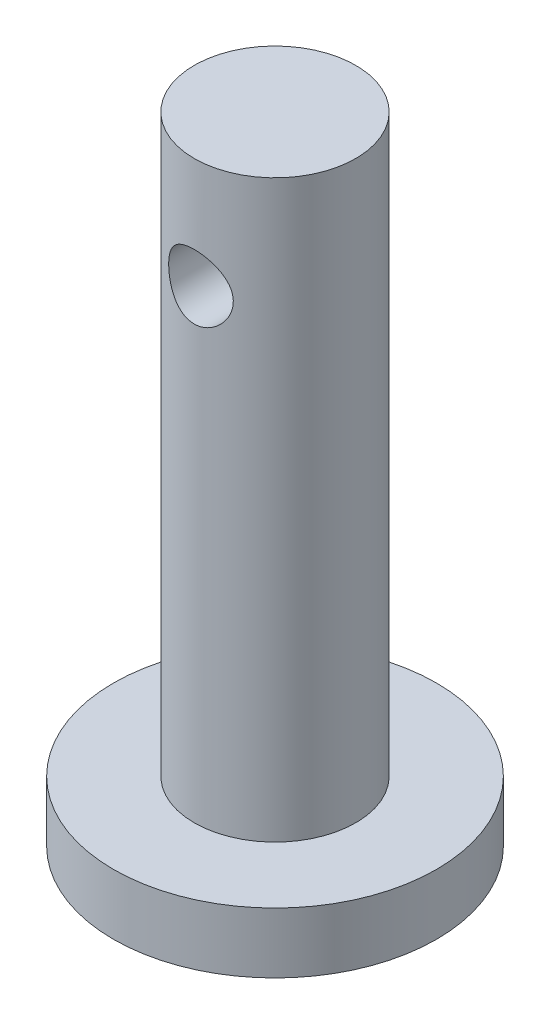
ISO-10303-21;
HEADER;
FILE_DESCRIPTION(('STEP AP214'),'2;1');
FILE_NAME('part.step','',(''),(''),'','','');
FILE_SCHEMA(('AUTOMOTIVE_DESIGN { 1 0 10303 214 1 1 1 1 }'));
ENDSEC;
DATA;
#1=APPLICATION_CONTEXT('core data for automotive mechanical design processes');
#2=APPLICATION_PROTOCOL_DEFINITION('international standard','automotive_design',2000,#1);
#3=PRODUCT_CONTEXT('',#1,'mechanical');
#4=PRODUCT('Part','Part','',(#3));
#5=PRODUCT_RELATED_PRODUCT_CATEGORY('part','',(#4));
#6=PRODUCT_DEFINITION_FORMATION('','',#4);
#7=PRODUCT_DEFINITION_CONTEXT('part definition',#1,'design');
#8=PRODUCT_DEFINITION('design','',#6,#7);
#9=PRODUCT_DEFINITION_SHAPE('','',#8);
#10=(LENGTH_UNIT() NAMED_UNIT(*) SI_UNIT(.MILLI.,.METRE.));
#11=(NAMED_UNIT(*) PLANE_ANGLE_UNIT() SI_UNIT($,.RADIAN.));
#12=(NAMED_UNIT(*) SI_UNIT($,.STERADIAN.) SOLID_ANGLE_UNIT());
#13=UNCERTAINTY_MEASURE_WITH_UNIT(LENGTH_MEASURE(1.E-05),#10,'distance_accuracy_value','');
#14=(GEOMETRIC_REPRESENTATION_CONTEXT(3) GLOBAL_UNCERTAINTY_ASSIGNED_CONTEXT((#13)) GLOBAL_UNIT_ASSIGNED_CONTEXT((#10,
#11,#12)) REPRESENTATION_CONTEXT('',''));
#15=CARTESIAN_POINT('',(0.,0.,0.));
#16=DIRECTION('',(0.,0.,1.));
#17=DIRECTION('',(1.,0.,0.));
#18=AXIS2_PLACEMENT_3D('',#15,#16,#17);
#19=CARTESIAN_POINT('',(0.,31.5,0.));
#20=DIRECTION('',(0.,-1.,0.));
#21=DIRECTION('',(0.,0.,-1.));
#22=AXIS2_PLACEMENT_3D('',#19,#20,#21);
#23=CYLINDRICAL_SURFACE('',#22,4.);
#24=CARTESIAN_POINT('',(0.,3.,0.));
#25=DIRECTION('',(0.,1.,0.));
#26=DIRECTION('',(0.,0.,1.));
#27=AXIS2_PLACEMENT_3D('',#24,#25,#26);
#28=CIRCLE('',#27,4.);
#29=CARTESIAN_POINT('',(0.,3.,4.));
#30=VERTEX_POINT('',#29);
#31=EDGE_CURVE('E53',#30,#30,#28,.T.);
#32=ORIENTED_EDGE('',*,*,#31,.T.);
#33=EDGE_LOOP('',(#32));
#34=FACE_BOUND('',#33,.T.);
#35=CARTESIAN_POINT('',(0.,31.5,0.));
#36=DIRECTION('',(0.,1.,0.));
#37=DIRECTION('',(0.,0.,1.));
#38=AXIS2_PLACEMENT_3D('',#35,#36,#37);
#39=CIRCLE('',#38,4.);
#40=CARTESIAN_POINT('',(0.,31.5,4.));
#41=VERTEX_POINT('',#40);
#42=EDGE_CURVE('E90',#41,#41,#39,.T.);
#43=ORIENTED_EDGE('',*,*,#42,.F.);
#44=EDGE_LOOP('',(#43));
#45=FACE_BOUND('',#44,.T.);
#46=CARTESIAN_POINT('',(-1.6,26.,3.66606055596467));
#47=CARTESIAN_POINT('',(-1.59999060336303,25.9142884015201,3.66606921325137));
#48=CARTESIAN_POINT('',(-1.59307185487548,25.8284555722362,3.66910881987412));
#49=CARTESIAN_POINT('',(-1.56565522447419,25.6592521336983,3.68088731350276));
#50=CARTESIAN_POINT('',(-1.5451226435537,25.5758883863356,3.68964076309481));
#51=CARTESIAN_POINT('',(-1.49138802605496,25.414357646424,3.71168364633037));
#52=CARTESIAN_POINT('',(-1.45823372202034,25.3361723621118,3.72495597085692));
#53=CARTESIAN_POINT('',(-1.38033621549729,25.1864919593123,3.75451732076224));
#54=CARTESIAN_POINT('',(-1.335595543414,25.1149953846793,3.77080568723138));
#55=CARTESIAN_POINT('',(-1.23305757966993,24.9765916782068,3.80560692040826));
#56=CARTESIAN_POINT('',(-1.17470348618186,24.9101148616564,3.82419134366997));
#57=CARTESIAN_POINT('',(-1.04776728461923,24.7875768021477,3.86089965583049));
#58=CARTESIAN_POINT('',(-0.979181617340544,24.7315191989681,3.87902338189098));
#59=CARTESIAN_POINT('',(-0.830405048285102,24.6292748824138,3.91362726325484));
#60=CARTESIAN_POINT('',(-0.749863172489824,24.5835645588235,3.93001442946855));
#61=CARTESIAN_POINT('',(-0.581460258300094,24.5065251452882,3.95843142105237));
#62=CARTESIAN_POINT('',(-0.493602215430367,24.4751902033744,3.97046301907739));
#63=CARTESIAN_POINT('',(-0.317573141471112,24.4293268108501,3.98830660006628));
#64=CARTESIAN_POINT('',(-0.229623187843683,24.4140581487288,3.99439149420286));
#65=CARTESIAN_POINT('',(-0.0522130629101198,24.3983772114698,4.00064248546163));
#66=CARTESIAN_POINT('',(0.0372465326603232,24.3979593952521,4.0008107901545));
#67=CARTESIAN_POINT('',(0.20978599577225,24.41158621582,3.99537570257429));
#68=CARTESIAN_POINT('',(0.292941962299227,24.4248198181975,3.99009597417469));
#69=CARTESIAN_POINT('',(0.455738487374671,24.4639943010486,3.97479433175032));
#70=CARTESIAN_POINT('',(0.535378787512127,24.4899361139203,3.9647720697689));
#71=CARTESIAN_POINT('',(0.690318350809326,24.554109186301,3.9407745956616));
#72=CARTESIAN_POINT('',(0.765534098703708,24.5925197718524,3.9267420837344));
#73=CARTESIAN_POINT('',(0.908646520592461,24.6803720055352,3.89611668143758));
#74=CARTESIAN_POINT('',(0.976540674172888,24.7298174344781,3.87952291412059));
#75=CARTESIAN_POINT('',(1.10781506239372,24.8421193087573,3.84417309742667));
#76=CARTESIAN_POINT('',(1.17060627621891,24.9056431140671,3.82534661216192));
#77=CARTESIAN_POINT('',(1.28488593230826,25.0423924574568,3.78849328771823));
#78=CARTESIAN_POINT('',(1.33637067500773,25.1156211585233,3.77046671181078));
#79=CARTESIAN_POINT('',(1.42792335099435,25.2723352179272,3.7367751795345));
#80=CARTESIAN_POINT('',(1.46762772138792,25.3560518643871,3.72119131345105));
#81=CARTESIAN_POINT('',(1.53214100797301,25.5297723923696,3.69510072373859));
#82=CARTESIAN_POINT('',(1.55695959872352,25.6197721478167,3.68459070338672));
#83=CARTESIAN_POINT('',(1.58956395906557,25.7976286219488,3.67063807738052));
#84=CARTESIAN_POINT('',(1.59829767744673,25.8852803576961,3.6668029315846));
#85=CARTESIAN_POINT('',(1.60124906115921,26.0608617662144,3.66551598301679));
#86=CARTESIAN_POINT('',(1.59547112847431,26.1487913466223,3.6680622444997));
#87=CARTESIAN_POINT('',(1.57042631583082,26.3171671479639,3.67884835485706));
#88=CARTESIAN_POINT('',(1.55194644961876,26.3977543499196,3.68675566238216));
#89=CARTESIAN_POINT('',(1.50304334952902,26.5546307238288,3.70696040822297));
#90=CARTESIAN_POINT('',(1.47261746744191,26.6309189384859,3.71925881990995));
#91=CARTESIAN_POINT('',(1.39930851158516,26.7804818862364,3.7474702548796));
#92=CARTESIAN_POINT('',(1.35597029461168,26.8535089509556,3.76350963711308));
#93=CARTESIAN_POINT('',(1.2585321795535,26.9915863899533,3.7972030812627));
#94=CARTESIAN_POINT('',(1.20442789878559,27.0566334982365,3.8148577991685));
#95=CARTESIAN_POINT('',(1.08227536934439,27.1818987268794,3.85136732777118));
#96=CARTESIAN_POINT('',(1.01349234355608,27.2414052522328,3.87021445828162));
#97=CARTESIAN_POINT('',(0.866466906695075,27.3481416612883,3.9057583565405));
#98=CARTESIAN_POINT('',(0.78822411077429,27.3953710452778,3.92245503674592));
#99=CARTESIAN_POINT('',(0.624223947201408,27.476038101169,3.95186972720228));
#100=CARTESIAN_POINT('',(0.538468384795252,27.5094790753326,3.96458868992219));
#101=CARTESIAN_POINT('',(0.36191487273538,27.5612390819261,3.98458170775432));
#102=CARTESIAN_POINT('',(0.271119688235416,27.5795663211521,3.99185871766035));
#103=CARTESIAN_POINT('',(0.0934532082770425,27.5996037613003,3.9998320656841));
#104=CARTESIAN_POINT('',(0.00671239407444431,27.6023201027701,4.00092677395898));
#105=CARTESIAN_POINT('',(-0.165947068586595,27.5937156165727,3.99748833902874));
#106=CARTESIAN_POINT('',(-0.251865839515698,27.5823969137715,3.9929560477353));
#107=CARTESIAN_POINT('',(-0.417736721557129,27.5467625693132,3.97897210691404));
#108=CARTESIAN_POINT('',(-0.497791043718707,27.5228568431396,3.96967584507464));
#109=CARTESIAN_POINT('',(-0.652737883807151,27.4631577563505,3.9471595826563));
#110=CARTESIAN_POINT('',(-0.727629446613821,27.4273622031837,3.93393885843209));
#111=CARTESIAN_POINT('',(-0.873762433484893,27.3431174412085,3.90414475488046));
#112=CARTESIAN_POINT('',(-0.944696309445141,27.2941789640919,3.88744903782584));
#113=CARTESIAN_POINT('',(-1.07764322281926,27.1857691846569,3.85271522549158));
#114=CARTESIAN_POINT('',(-1.13965254859661,27.1262935228319,3.834676576404));
#115=CARTESIAN_POINT('',(-1.25696101206879,26.99414782038,3.79790210847538));
#116=CARTESIAN_POINT('',(-1.31160710975922,26.9208889012791,3.77919226084307));
#117=CARTESIAN_POINT('',(-1.40787796035152,26.765646290057,3.74439737180144));
#118=CARTESIAN_POINT('',(-1.44950118231999,26.6836615736721,3.72831263909964));
#119=CARTESIAN_POINT('',(-1.51519287013865,26.5207702385215,3.70207091566326));
#120=CARTESIAN_POINT('',(-1.54050201133137,26.4404278121991,3.69151134889319));
#121=CARTESIAN_POINT('',(-1.57817420625471,26.2764116642957,3.67556802883171));
#122=CARTESIAN_POINT('',(-1.59057333431041,26.1927479072264,3.6701698565774));
#123=CARTESIAN_POINT('',(-1.59877140664814,26.0724979501297,3.66659567006108));
#124=CARTESIAN_POINT('',(-1.6000039751959,26.0362598232019,3.66605689354686));
#125=CARTESIAN_POINT('',(-1.6,26.,3.66606055596467));
#126=B_SPLINE_CURVE_WITH_KNOTS('',3,(#46,#47,#48,#49,#50,#51,#52,#53,#54,#55,#56,#57,#58,#59,
#60,#61,#62,#63,#64,#65,#66,#67,#68,#69,#70,#71,#72,#73,#74,#75,#76,#77,#78,#79,#80,#81,#82,#83,
#84,#85,#86,#87,#88,#89,#90,#91,#92,#93,#94,#95,#96,#97,#98,#99,#100,#101,#102,#103,#104,#105,
#106,#107,#108,#109,#110,#111,#112,#113,#114,#115,#116,#117,#118,#119,#120,#121,#122,#123,#124,
#125),.UNSPECIFIED.,.T.,.F.,(4,2,2,2,2,2,2,2,2,2,2,2,2,2,2,2,2,2,2,2,2,2,2,2,2,2,2,2,2,2,2,2,2,
2,2,2,2,2,2,4),(0.,0.257022119014121,0.514701868657797,0.771416658634712,1.0280754305909,
1.2980449462754,1.56810859478674,1.84882135273143,2.12941973575584,2.39643346309747,
2.66334756244538,2.91526915864242,3.16720924103248,3.42294640187919,3.67877131952025,
3.95139235265085,4.22410245701701,4.50451566971661,4.78474643835289,5.04785718014745,
5.3108881192156,5.55893798463324,5.80704286916518,6.06520923717368,6.32348091615887,
6.60082987392791,6.87819011877406,7.15548389845457,7.43262700758517,7.6916883179997,
7.95071041205289,8.20177595549889,8.45288782258076,8.71509640907148,8.97741373246573,
9.25597002623699,9.53455905402558,9.78813328650469,10.040997041706,10.1497288441659),.UNSPECIFIED.);
#127=CARTESIAN_POINT('',(-1.6,26.,3.66606055596467));
#128=VERTEX_POINT('',#127);
#129=EDGE_CURVE('E57',#128,#128,#126,.T.);
#130=ORIENTED_EDGE('',*,*,#129,.F.);
#131=EDGE_LOOP('',(#130));
#132=FACE_BOUND('',#131,.T.);
#133=CARTESIAN_POINT('',(0.,27.6,-4.));
#134=CARTESIAN_POINT('',(0.0859944043543127,27.599992118541,-3.99999416981668));
#135=CARTESIAN_POINT('',(0.172138051272538,27.5930257983293,-3.99719435445546));
#136=CARTESIAN_POINT('',(0.341997184334316,27.565401837183,-3.98626762480513));
#137=CARTESIAN_POINT('',(0.425705422048998,27.5447069767311,-3.97812622959102));
#138=CARTESIAN_POINT('',(0.587963138181922,27.4904991375529,-3.95739367370495));
#139=CARTESIAN_POINT('',(0.666528529293567,27.4570281230266,-3.94481709091258));
#140=CARTESIAN_POINT('',(0.816857576262694,27.3783846613388,-3.91645288636862));
#141=CARTESIAN_POINT('',(0.888623581400794,27.3332162760649,-3.90066637966445));
#142=CARTESIAN_POINT('',(1.02680080605631,27.2302116011513,-3.86664708936335));
#143=CARTESIAN_POINT('',(1.09284981804017,27.1719146750078,-3.84833837543353));
#144=CARTESIAN_POINT('',(1.21454000382778,27.0452799972186,-3.81168461524956));
#145=CARTESIAN_POINT('',(1.27017608570683,26.9769373622306,-3.79333955563034));
#146=CARTESIAN_POINT('',(1.3718996538343,26.8284575438062,-3.75778233437709));
#147=CARTESIAN_POINT('',(1.41745198495638,26.7479308111814,-3.74065692771961));
#148=CARTESIAN_POINT('',(1.49420377522972,26.579570881264,-3.71066917749434));
#149=CARTESIAN_POINT('',(1.52541005142867,26.4917411777213,-3.69780480995341));
#150=CARTESIAN_POINT('',(1.57111905871669,26.3154301331263,-3.67861086128655));
#151=CARTESIAN_POINT('',(1.58631517264452,26.227159011539,-3.67201136284484));
#152=CARTESIAN_POINT('',(1.60173836931202,26.0490920013542,-3.66531203239315));
#153=CARTESIAN_POINT('',(1.60197281305058,25.9592968843,-3.66520900418215));
#154=CARTESIAN_POINT('',(1.58799149400364,25.7873946628336,-3.67128400223995));
#155=CARTESIAN_POINT('',(1.57478025144411,25.7051874284728,-3.6770254003076));
#156=CARTESIAN_POINT('',(1.53595750423826,25.5442723551946,-3.69340950086269));
#157=CARTESIAN_POINT('',(1.51034383584371,25.4655651295118,-3.70405305857338));
#158=CARTESIAN_POINT('',(1.44695578604086,25.3119857310432,-3.72927588070824));
#159=CARTESIAN_POINT('',(1.40894388985225,25.2372246087563,-3.7439310342463));
#160=CARTESIAN_POINT('',(1.32200516858577,25.0948673469107,-3.77550493111912));
#161=CARTESIAN_POINT('',(1.27307424408067,25.0272739124778,-3.79242452365479));
#162=CARTESIAN_POINT('',(1.16124047956355,24.8956722169584,-3.82821389393817));
#163=CARTESIAN_POINT('',(1.09754997037651,24.8323450164432,-3.84713331980921));
#164=CARTESIAN_POINT('',(0.960251541944155,24.7170524175984,-3.88367859966626));
#165=CARTESIAN_POINT('',(0.886641652267549,24.6650892820718,-3.9013041955626));
#166=CARTESIAN_POINT('',(0.729662122084677,24.5731060420673,-3.93371745011639));
#167=CARTESIAN_POINT('',(0.646128393077185,24.5333421750424,-3.94844216076332));
#168=CARTESIAN_POINT('',(0.472819012386308,24.4686657111376,-3.97291862663007));
#169=CARTESIAN_POINT('',(0.38304655747974,24.4437455699541,-3.98267290769906));
#170=CARTESIAN_POINT('',(0.205516710086256,24.4108413636642,-3.99564911605528));
#171=CARTESIAN_POINT('',(0.117954635188428,24.4019420365972,-3.99922356666811));
#172=CARTESIAN_POINT('',(-0.0574762478462534,24.3986295195771,-4.00054782808505));
#173=CARTESIAN_POINT('',(-0.145344970579138,24.404212574762,-3.99829914865833));
#174=CARTESIAN_POINT('',(-0.31474619129759,24.4290334020416,-3.98846053651002));
#175=CARTESIAN_POINT('',(-0.396385993420379,24.4476463842808,-3.98111513076419));
#176=CARTESIAN_POINT('',(-0.555308342448624,24.4971485666479,-3.962075531244));
#177=CARTESIAN_POINT('',(-0.632590328179875,24.5280393437349,-3.95038077885224));
#178=CARTESIAN_POINT('',(-0.78326302865336,24.602227951744,-3.92333275816649));
#179=CARTESIAN_POINT('',(-0.856462418204322,24.6458763776345,-3.90787852783843));
#180=CARTESIAN_POINT('',(-0.994754872997242,24.7439522591245,-3.8749869179642));
#181=CARTESIAN_POINT('',(-1.0598446726089,24.7983840343381,-3.85754874488216));
#182=CARTESIAN_POINT('',(-1.18457843442305,24.9206960103597,-3.82116094110489));
#183=CARTESIAN_POINT('',(-1.24357914704485,24.989226833205,-3.80218753140042));
#184=CARTESIAN_POINT('',(-1.34940095793097,25.1355520664075,-3.76593338333706));
#185=CARTESIAN_POINT('',(-1.39622004907001,25.213348000272,-3.74865292421209));
#186=CARTESIAN_POINT('',(-1.4766460015453,25.3771693556753,-3.71771439926167));
#187=CARTESIAN_POINT('',(-1.51012047562756,25.4632671993699,-3.7040930470783));
#188=CARTESIAN_POINT('',(-1.56183697576424,25.6405869213721,-3.68258938782345));
#189=CARTESIAN_POINT('',(-1.58009024421545,25.7318049646499,-3.67470284556799));
#190=CARTESIAN_POINT('',(-1.59977249382272,25.9097023214196,-3.66617407439941));
#191=CARTESIAN_POINT('',(-1.60231766584229,25.9962358716747,-3.66505136806537));
#192=CARTESIAN_POINT('',(-1.59344252742202,26.1684358861706,-3.66891868826478));
#193=CARTESIAN_POINT('',(-1.58202399033103,26.2541024591221,-3.67390793859835));
#194=CARTESIAN_POINT('',(-1.54645709292292,26.418665751884,-3.68901319263217));
#195=CARTESIAN_POINT('',(-1.52282999485678,26.4976962195464,-3.6989186546196));
#196=CARTESIAN_POINT('',(-1.46400435879281,26.6507029036908,-3.72259200986157));
#197=CARTESIAN_POINT('',(-1.42880262511505,26.7246777175199,-3.73636096964805));
#198=CARTESIAN_POINT('',(-1.34549821020778,26.8700876954166,-3.76718887683593));
#199=CARTESIAN_POINT('',(-1.29677226812759,26.9411349361044,-3.78439105850594));
#200=CARTESIAN_POINT('',(-1.1887136954172,27.074394653763,-3.8197104349779));
#201=CARTESIAN_POINT('',(-1.1293778678545,27.1366044577027,-3.83782790438725));
#202=CARTESIAN_POINT('',(-0.99720440501797,27.2545622826109,-3.87434853669915));
#203=CARTESIAN_POINT('',(-0.923740800916911,27.3096298455185,-3.89269406369748));
#204=CARTESIAN_POINT('',(-0.767920256228623,27.4066696340973,-3.92640325370973));
#205=CARTESIAN_POINT('',(-0.68555920363779,27.448635769722,-3.94176552874325));
#206=CARTESIAN_POINT('',(-0.515790449996163,27.5172977721522,-3.96751771852689));
#207=CARTESIAN_POINT('',(-0.428505294575757,27.5442634588483,-3.97799490444022));
#208=CARTESIAN_POINT('',(-0.250301237024977,27.5829112967634,-3.99315444967493));
#209=CARTESIAN_POINT('',(-0.159394820687129,27.5946419493951,-3.9978551959651));
#210=CARTESIAN_POINT('',(-0.0455298383127425,27.5995163047826,-3.99980719603309));
#211=CARTESIAN_POINT('',(-0.0227701509926061,27.6000020869034,-4.00000154375341));
#212=CARTESIAN_POINT('',(0.,27.6,-4.));
#213=B_SPLINE_CURVE_WITH_KNOTS('',3,(#133,#134,#135,#136,#137,#138,#139,#140,#141,#142,#143,
#144,#145,#146,#147,#148,#149,#150,#151,#152,#153,#154,#155,#156,#157,#158,#159,#160,#161,#162,
#163,#164,#165,#166,#167,#168,#169,#170,#171,#172,#173,#174,#175,#176,#177,#178,#179,#180,#181,
#182,#183,#184,#185,#186,#187,#188,#189,#190,#191,#192,#193,#194,#195,#196,#197,#198,#199,#200,
#201,#202,#203,#204,#205,#206,#207,#208,#209,#210,#211,#212),.UNSPECIFIED.,.T.,.F.,(4,2,2,2,2,2,
2,2,2,2,2,2,2,2,2,2,2,2,2,2,2,2,2,2,2,2,2,2,2,2,2,2,2,2,2,2,2,2,2,4),(0.,0.257922390314456,
0.516546908806347,0.774329165977266,1.03202202854387,1.30077905360317,1.56966715947529,
1.85052207055374,2.13124338494614,2.39923284247062,2.6670904507239,2.91630662721098,
3.16556629804838,3.41991301039053,3.67435537550547,3.94846679349246,4.22263274271786,
4.50221530530245,4.78165564891032,5.04455347622406,5.30738314856066,5.55840364451493,
5.80945639195037,6.0681881071861,6.32702367599175,6.60294779699531,6.87891735234998,
7.15756036112662,7.43599738116747,7.69439738714198,7.95276458050437,8.20091454839016,
8.44913308644129,8.71156374445354,8.97407361078715,9.25360338827069,9.53326290912426,
9.80771440810655,10.0812900192347,10.1495843671744),.UNSPECIFIED.);
#214=CARTESIAN_POINT('',(0.,27.6,-4.));
#215=VERTEX_POINT('',#214);
#216=EDGE_CURVE('E39',#215,#215,#213,.T.);
#217=ORIENTED_EDGE('',*,*,#216,.F.);
#218=EDGE_LOOP('',(#217));
#219=FACE_BOUND('',#218,.T.);
#220=ADVANCED_FACE('F35',(#34,#45,#132,#219),#23,.T.);
#221=CARTESIAN_POINT('',(0.,3.,0.));
#222=DIRECTION('',(0.,1.,0.));
#223=DIRECTION('',(0.,0.,1.));
#224=AXIS2_PLACEMENT_3D('',#221,#222,#223);
#225=PLANE('',#224);
#226=CARTESIAN_POINT('',(0.,3.,0.));
#227=DIRECTION('',(0.,1.,0.));
#228=DIRECTION('',(0.,0.,1.));
#229=AXIS2_PLACEMENT_3D('',#226,#227,#228);
#230=CIRCLE('',#229,8.);
#231=CARTESIAN_POINT('',(0.,3.,8.));
#232=VERTEX_POINT('',#231);
#233=EDGE_CURVE('E10',#232,#232,#230,.T.);
#234=ORIENTED_EDGE('',*,*,#233,.T.);
#235=EDGE_LOOP('',(#234));
#236=FACE_BOUND('',#235,.T.);
#237=ORIENTED_EDGE('',*,*,#31,.F.);
#238=EDGE_LOOP('',(#237));
#239=FACE_BOUND('',#238,.T.);
#240=ADVANCED_FACE('F80',(#236,#239),#225,.T.);
#241=CARTESIAN_POINT('',(0.,0.,0.));
#242=DIRECTION('',(0.,1.,0.));
#243=DIRECTION('',(0.,0.,1.));
#244=AXIS2_PLACEMENT_3D('',#241,#242,#243);
#245=PLANE('',#244);
#246=CARTESIAN_POINT('',(0.,0.,0.));
#247=DIRECTION('',(0.,1.,0.));
#248=DIRECTION('',(0.,0.,1.));
#249=AXIS2_PLACEMENT_3D('',#246,#247,#248);
#250=CIRCLE('',#249,8.);
#251=CARTESIAN_POINT('',(0.,0.,8.));
#252=VERTEX_POINT('',#251);
#253=EDGE_CURVE('E48',#252,#252,#250,.T.);
#254=ORIENTED_EDGE('',*,*,#253,.F.);
#255=EDGE_LOOP('',(#254));
#256=FACE_BOUND('',#255,.T.);
#257=ADVANCED_FACE('F76',(#256),#245,.F.);
#258=CARTESIAN_POINT('',(0.,3.,0.));
#259=DIRECTION('',(0.,-1.,0.));
#260=DIRECTION('',(0.,0.,-1.));
#261=AXIS2_PLACEMENT_3D('',#258,#259,#260);
#262=CYLINDRICAL_SURFACE('',#261,8.);
#263=ORIENTED_EDGE('',*,*,#233,.F.);
#264=EDGE_LOOP('',(#263));
#265=FACE_BOUND('',#264,.T.);
#266=ORIENTED_EDGE('',*,*,#253,.T.);
#267=EDGE_LOOP('',(#266));
#268=FACE_BOUND('',#267,.T.);
#269=ADVANCED_FACE('F37',(#265,#268),#262,.T.);
#270=CARTESIAN_POINT('',(0.,31.5,0.));
#271=DIRECTION('',(0.,1.,0.));
#272=DIRECTION('',(0.,0.,1.));
#273=AXIS2_PLACEMENT_3D('',#270,#271,#272);
#274=PLANE('',#273);
#275=ORIENTED_EDGE('',*,*,#42,.T.);
#276=EDGE_LOOP('',(#275));
#277=FACE_BOUND('',#276,.T.);
#278=ADVANCED_FACE('F68',(#277),#274,.T.);
#279=CARTESIAN_POINT('',(0.,26.,10.));
#280=DIRECTION('',(0.,0.,-1.));
#281=DIRECTION('',(-1.,0.,0.));
#282=AXIS2_PLACEMENT_3D('',#279,#280,#281);
#283=CYLINDRICAL_SURFACE('',#282,1.6);
#284=ORIENTED_EDGE('',*,*,#129,.T.);
#285=EDGE_LOOP('',(#284));
#286=FACE_BOUND('',#285,.T.);
#287=ORIENTED_EDGE('',*,*,#216,.T.);
#288=EDGE_LOOP('',(#287));
#289=FACE_BOUND('',#288,.T.);
#290=ADVANCED_FACE('F65',(#286,#289),#283,.F.);
#291=CLOSED_SHELL('',(#220,#240,#257,#269,#278,#290));
#292=MANIFOLD_SOLID_BREP('B2',#291);
#293=ADVANCED_BREP_SHAPE_REPRESENTATION('',(#18,#292),#14);
#294=SHAPE_DEFINITION_REPRESENTATION(#9,#293);
ENDSEC;
END-ISO-10303-21;
